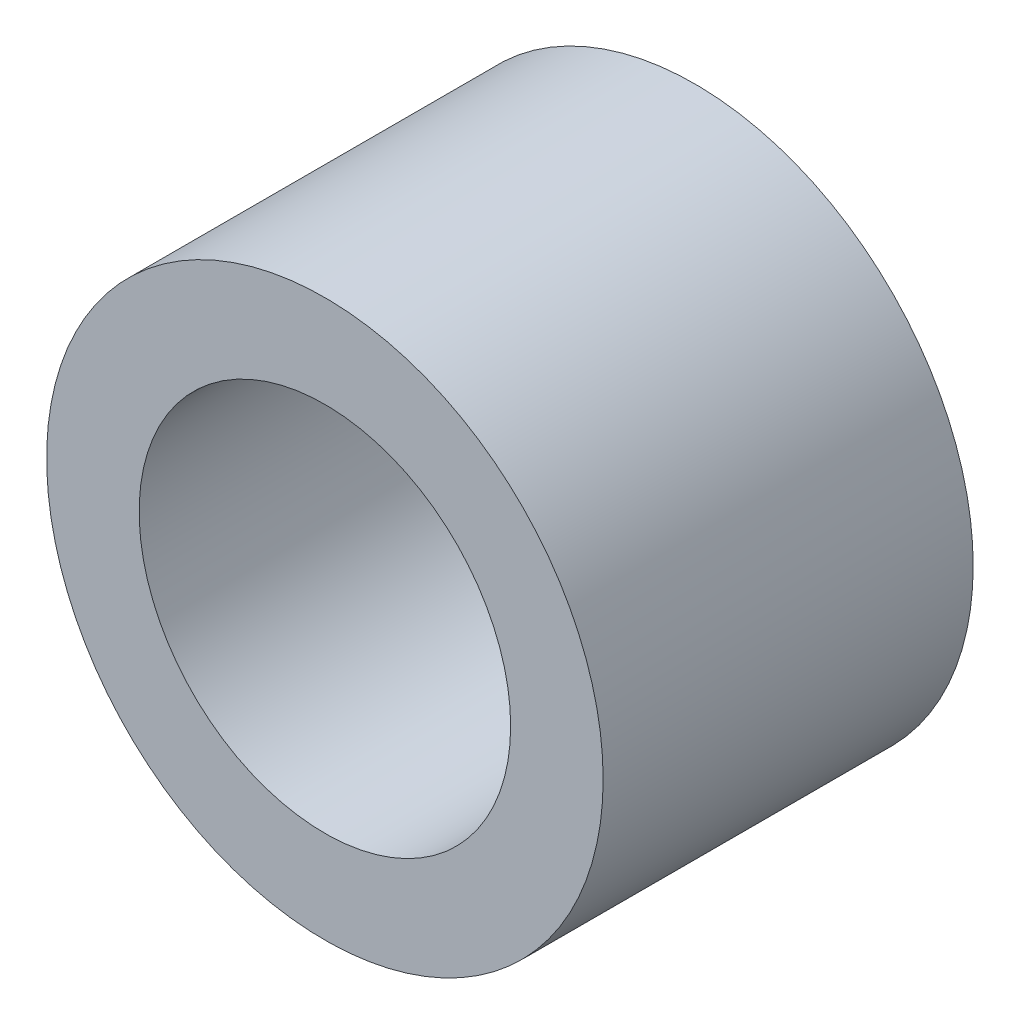
ISO-10303-21;
HEADER;
FILE_DESCRIPTION(('STEP AP214'),'2;1');
FILE_NAME('part.step','',(''),(''),'','','');
FILE_SCHEMA(('AUTOMOTIVE_DESIGN { 1 0 10303 214 1 1 1 1 }'));
ENDSEC;
DATA;
#1=APPLICATION_CONTEXT('core data for automotive mechanical design processes');
#2=APPLICATION_PROTOCOL_DEFINITION('international standard','automotive_design',2000,#1);
#3=PRODUCT_CONTEXT('',#1,'mechanical');
#4=PRODUCT('Part','Part','',(#3));
#5=PRODUCT_RELATED_PRODUCT_CATEGORY('part','',(#4));
#6=PRODUCT_DEFINITION_FORMATION('','',#4);
#7=PRODUCT_DEFINITION_CONTEXT('part definition',#1,'design');
#8=PRODUCT_DEFINITION('design','',#6,#7);
#9=PRODUCT_DEFINITION_SHAPE('','',#8);
#10=(LENGTH_UNIT() NAMED_UNIT(*) SI_UNIT(.MILLI.,.METRE.));
#11=(NAMED_UNIT(*) PLANE_ANGLE_UNIT() SI_UNIT($,.RADIAN.));
#12=(NAMED_UNIT(*) SI_UNIT($,.STERADIAN.) SOLID_ANGLE_UNIT());
#13=UNCERTAINTY_MEASURE_WITH_UNIT(LENGTH_MEASURE(1.E-05),#10,'distance_accuracy_value','');
#14=(GEOMETRIC_REPRESENTATION_CONTEXT(3) GLOBAL_UNCERTAINTY_ASSIGNED_CONTEXT((#13)) GLOBAL_UNIT_ASSIGNED_CONTEXT((#10,
#11,#12)) REPRESENTATION_CONTEXT('',''));
#15=CARTESIAN_POINT('',(0.,0.,0.));
#16=DIRECTION('',(0.,0.,1.));
#17=DIRECTION('',(1.,0.,0.));
#18=AXIS2_PLACEMENT_3D('',#15,#16,#17);
#19=CARTESIAN_POINT('',(0.,0.,3.175));
#20=DIRECTION('',(0.,0.,1.));
#21=DIRECTION('',(1.,0.,0.));
#22=AXIS2_PLACEMENT_3D('',#19,#20,#21);
#23=PLANE('',#22);
#24=CARTESIAN_POINT('',(0.,0.,3.175));
#25=DIRECTION('',(0.,0.,1.));
#26=DIRECTION('',(1.,0.,0.));
#27=AXIS2_PLACEMENT_3D('',#24,#25,#26);
#28=CIRCLE('',#27,4.7752);
#29=CARTESIAN_POINT('',(4.7752,0.,3.175));
#30=VERTEX_POINT('',#29);
#31=EDGE_CURVE('E10',#30,#30,#28,.T.);
#32=ORIENTED_EDGE('',*,*,#31,.T.);
#33=EDGE_LOOP('',(#32));
#34=FACE_BOUND('',#33,.T.);
#35=CARTESIAN_POINT('',(0.,0.,3.175));
#36=DIRECTION('',(0.,0.,1.));
#37=DIRECTION('',(1.,0.,0.));
#38=AXIS2_PLACEMENT_3D('',#35,#36,#37);
#39=CIRCLE('',#38,3.1877);
#40=CARTESIAN_POINT('',(3.1877,0.,3.175));
#41=VERTEX_POINT('',#40);
#42=EDGE_CURVE('E42',#41,#41,#39,.T.);
#43=ORIENTED_EDGE('',*,*,#42,.F.);
#44=EDGE_LOOP('',(#43));
#45=FACE_BOUND('',#44,.T.);
#46=ADVANCED_FACE('F31',(#34,#45),#23,.T.);
#47=CARTESIAN_POINT('',(0.,0.,-3.175));
#48=DIRECTION('',(0.,0.,1.));
#49=DIRECTION('',(1.,0.,0.));
#50=AXIS2_PLACEMENT_3D('',#47,#48,#49);
#51=PLANE('',#50);
#52=CARTESIAN_POINT('',(0.,0.,-3.175));
#53=DIRECTION('',(0.,0.,1.));
#54=DIRECTION('',(1.,0.,0.));
#55=AXIS2_PLACEMENT_3D('',#52,#53,#54);
#56=CIRCLE('',#55,4.7752);
#57=CARTESIAN_POINT('',(4.7752,0.,-3.175));
#58=VERTEX_POINT('',#57);
#59=EDGE_CURVE('E35',#58,#58,#56,.T.);
#60=ORIENTED_EDGE('',*,*,#59,.F.);
#61=EDGE_LOOP('',(#60));
#62=FACE_BOUND('',#61,.T.);
#63=CARTESIAN_POINT('',(0.,0.,-3.175));
#64=DIRECTION('',(0.,0.,1.));
#65=DIRECTION('',(1.,0.,0.));
#66=AXIS2_PLACEMENT_3D('',#63,#64,#65);
#67=CIRCLE('',#66,3.1877);
#68=CARTESIAN_POINT('',(3.1877,0.,-3.175));
#69=VERTEX_POINT('',#68);
#70=EDGE_CURVE('E44',#69,#69,#67,.T.);
#71=ORIENTED_EDGE('',*,*,#70,.T.);
#72=EDGE_LOOP('',(#71));
#73=FACE_BOUND('',#72,.T.);
#74=ADVANCED_FACE('F54',(#62,#73),#51,.F.);
#75=CARTESIAN_POINT('',(0.,0.,3.175));
#76=DIRECTION('',(0.,0.,-1.));
#77=DIRECTION('',(-1.,0.,0.));
#78=AXIS2_PLACEMENT_3D('',#75,#76,#77);
#79=CYLINDRICAL_SURFACE('',#78,4.7752);
#80=ORIENTED_EDGE('',*,*,#31,.F.);
#81=EDGE_LOOP('',(#80));
#82=FACE_BOUND('',#81,.T.);
#83=ORIENTED_EDGE('',*,*,#59,.T.);
#84=EDGE_LOOP('',(#83));
#85=FACE_BOUND('',#84,.T.);
#86=ADVANCED_FACE('F33',(#82,#85),#79,.T.);
#87=CARTESIAN_POINT('',(0.,0.,3.175));
#88=DIRECTION('',(0.,0.,-1.));
#89=DIRECTION('',(-1.,0.,0.));
#90=AXIS2_PLACEMENT_3D('',#87,#88,#89);
#91=CYLINDRICAL_SURFACE('',#90,3.1877);
#92=ORIENTED_EDGE('',*,*,#42,.T.);
#93=EDGE_LOOP('',(#92));
#94=FACE_BOUND('',#93,.T.);
#95=ORIENTED_EDGE('',*,*,#70,.F.);
#96=EDGE_LOOP('',(#95));
#97=FACE_BOUND('',#96,.T.);
#98=ADVANCED_FACE('F50',(#94,#97),#91,.F.);
#99=CLOSED_SHELL('',(#46,#74,#86,#98));
#100=MANIFOLD_SOLID_BREP('B2',#99);
#101=ADVANCED_BREP_SHAPE_REPRESENTATION('',(#18,#100),#14);
#102=SHAPE_DEFINITION_REPRESENTATION(#9,#101);
ENDSEC;
END-ISO-10303-21;
